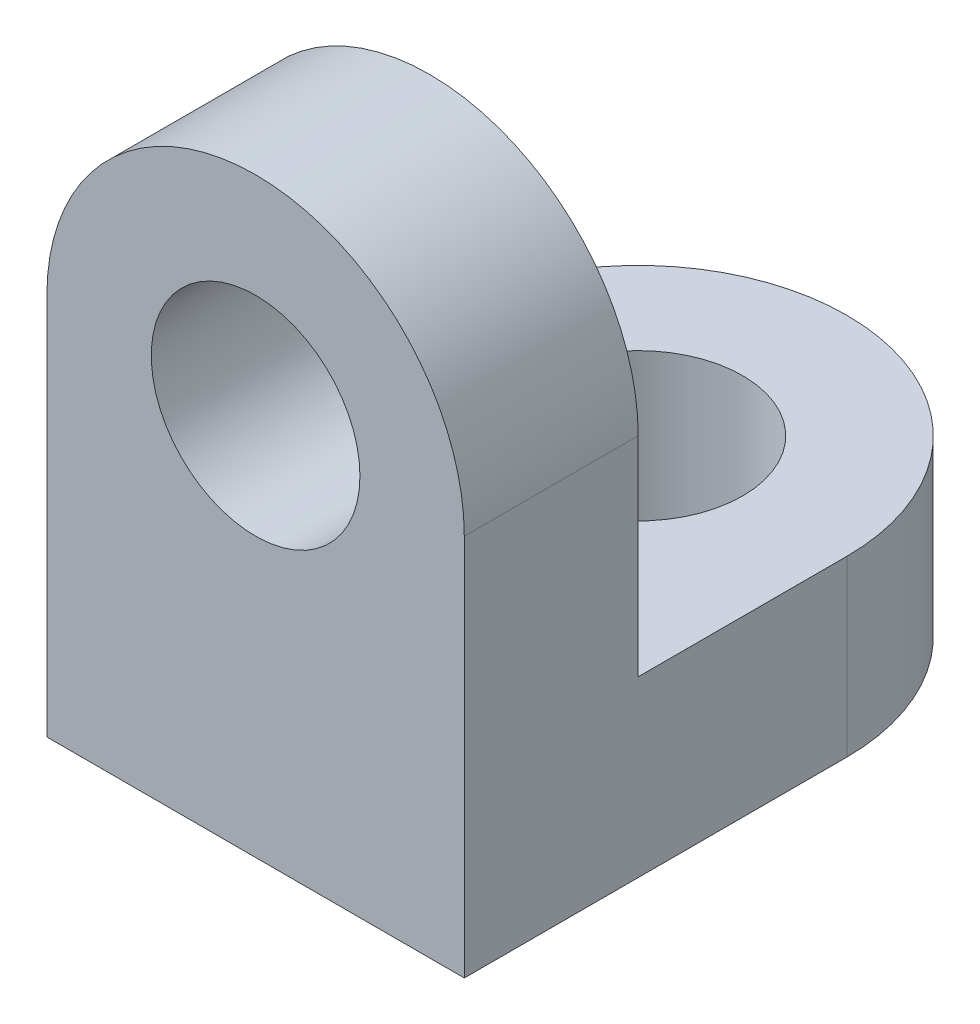
ISO-10303-21;
HEADER;
FILE_DESCRIPTION(('STEP AP214'),'2;1');
FILE_NAME('part.step','',(''),(''),'','','');
FILE_SCHEMA(('AUTOMOTIVE_DESIGN { 1 0 10303 214 1 1 1 1 }'));
ENDSEC;
DATA;
#1=APPLICATION_CONTEXT('core data for automotive mechanical design processes');
#2=APPLICATION_PROTOCOL_DEFINITION('international standard','automotive_design',2000,#1);
#3=PRODUCT_CONTEXT('',#1,'mechanical');
#4=PRODUCT('Part','Part','',(#3));
#5=PRODUCT_RELATED_PRODUCT_CATEGORY('part','',(#4));
#6=PRODUCT_DEFINITION_FORMATION('','',#4);
#7=PRODUCT_DEFINITION_CONTEXT('part definition',#1,'design');
#8=PRODUCT_DEFINITION('design','',#6,#7);
#9=PRODUCT_DEFINITION_SHAPE('','',#8);
#10=(LENGTH_UNIT() NAMED_UNIT(*) SI_UNIT(.MILLI.,.METRE.));
#11=(NAMED_UNIT(*) PLANE_ANGLE_UNIT() SI_UNIT($,.RADIAN.));
#12=(NAMED_UNIT(*) SI_UNIT($,.STERADIAN.) SOLID_ANGLE_UNIT());
#13=UNCERTAINTY_MEASURE_WITH_UNIT(LENGTH_MEASURE(1.E-05),#10,'distance_accuracy_value','');
#14=(GEOMETRIC_REPRESENTATION_CONTEXT(3) GLOBAL_UNCERTAINTY_ASSIGNED_CONTEXT((#13)) GLOBAL_UNIT_ASSIGNED_CONTEXT((#10,
#11,#12)) REPRESENTATION_CONTEXT('',''));
#15=CARTESIAN_POINT('',(0.,0.,0.));
#16=DIRECTION('',(0.,0.,1.));
#17=DIRECTION('',(1.,0.,0.));
#18=AXIS2_PLACEMENT_3D('',#15,#16,#17);
#19=CARTESIAN_POINT('',(0.,0.,10.));
#20=DIRECTION('',(0.,0.,1.));
#21=DIRECTION('',(1.,0.,0.));
#22=AXIS2_PLACEMENT_3D('',#19,#20,#21);
#23=PLANE('',#22);
#24=CARTESIAN_POINT('',(0.,0.,10.));
#25=DIRECTION('',(0.,0.,1.));
#26=DIRECTION('',(1.,0.,0.));
#27=AXIS2_PLACEMENT_3D('',#24,#25,#26);
#28=CIRCLE('',#27,12.);
#29=CARTESIAN_POINT('',(12.,0.,10.));
#30=VERTEX_POINT('',#29);
#31=CARTESIAN_POINT('',(-12.,0.,10.));
#32=VERTEX_POINT('',#31);
#33=EDGE_CURVE('E154',#30,#32,#28,.T.);
#34=ORIENTED_EDGE('',*,*,#33,.T.);
#35=DIRECTION('',(0.,-1.,0.));
#36=VECTOR('',#35,1.);
#37=CARTESIAN_POINT('',(-12.,-12.,10.));
#38=LINE('',#37,#36);
#39=CARTESIAN_POINT('',(-12.,-21.9999999999999,10.));
#40=VERTEX_POINT('',#39);
#41=EDGE_CURVE('E157',#32,#40,#38,.T.);
#42=ORIENTED_EDGE('',*,*,#41,.T.);
#43=DIRECTION('',(-1.,0.,0.));
#44=VECTOR('',#43,1.);
#45=CARTESIAN_POINT('',(26.1421356237309,-21.9999999999999,10.));
#46=LINE('',#45,#44);
#47=CARTESIAN_POINT('',(12.,-21.9999999999999,10.));
#48=VERTEX_POINT('',#47);
#49=EDGE_CURVE('E117',#48,#40,#46,.T.);
#50=ORIENTED_EDGE('',*,*,#49,.F.);
#51=DIRECTION('',(0.,1.,0.));
#52=VECTOR('',#51,1.);
#53=CARTESIAN_POINT('',(12.,0.,10.));
#54=LINE('',#53,#52);
#55=EDGE_CURVE('E57',#48,#30,#54,.T.);
#56=ORIENTED_EDGE('',*,*,#55,.T.);
#57=EDGE_LOOP('',(#34,#42,#50,#56));
#58=FACE_BOUND('',#57,.T.);
#59=CARTESIAN_POINT('',(0.,0.,10.));
#60=DIRECTION('',(0.,0.,1.));
#61=DIRECTION('',(1.,0.,0.));
#62=AXIS2_PLACEMENT_3D('',#59,#60,#61);
#63=CIRCLE('',#62,6.);
#64=CARTESIAN_POINT('',(6.,0.,10.));
#65=VERTEX_POINT('',#64);
#66=EDGE_CURVE('E146',#65,#65,#63,.T.);
#67=ORIENTED_EDGE('',*,*,#66,.F.);
#68=EDGE_LOOP('',(#67));
#69=FACE_BOUND('',#68,.T.);
#70=ADVANCED_FACE('F39',(#58,#69),#23,.T.);
#71=CARTESIAN_POINT('',(0.,0.,0.));
#72=DIRECTION('',(0.,0.,1.));
#73=DIRECTION('',(1.,0.,0.));
#74=AXIS2_PLACEMENT_3D('',#71,#72,#73);
#75=PLANE('',#74);
#76=CARTESIAN_POINT('',(0.,0.,0.));
#77=DIRECTION('',(0.,0.,1.));
#78=DIRECTION('',(1.,0.,0.));
#79=AXIS2_PLACEMENT_3D('',#76,#77,#78);
#80=CIRCLE('',#79,12.);
#81=CARTESIAN_POINT('',(12.,0.,0.));
#82=VERTEX_POINT('',#81);
#83=CARTESIAN_POINT('',(-12.,0.,0.));
#84=VERTEX_POINT('',#83);
#85=EDGE_CURVE('E150',#82,#84,#80,.T.);
#86=ORIENTED_EDGE('',*,*,#85,.F.);
#87=DIRECTION('',(0.,1.,0.));
#88=VECTOR('',#87,1.);
#89=CARTESIAN_POINT('',(12.,0.,0.));
#90=LINE('',#89,#88);
#91=CARTESIAN_POINT('',(12.,-12.,0.));
#92=VERTEX_POINT('',#91);
#93=EDGE_CURVE('E158',#92,#82,#90,.T.);
#94=ORIENTED_EDGE('',*,*,#93,.F.);
#95=DIRECTION('',(1.,0.,0.));
#96=VECTOR('',#95,1.);
#97=CARTESIAN_POINT('',(12.,-12.,0.));
#98=LINE('',#97,#96);
#99=CARTESIAN_POINT('',(-12.,-12.,0.));
#100=VERTEX_POINT('',#99);
#101=EDGE_CURVE('E127',#100,#92,#98,.T.);
#102=ORIENTED_EDGE('',*,*,#101,.F.);
#103=DIRECTION('',(0.,-1.,0.));
#104=VECTOR('',#103,1.);
#105=CARTESIAN_POINT('',(-12.,-12.,0.));
#106=LINE('',#105,#104);
#107=EDGE_CURVE('E69',#84,#100,#106,.T.);
#108=ORIENTED_EDGE('',*,*,#107,.F.);
#109=EDGE_LOOP('',(#86,#94,#102,#108));
#110=FACE_BOUND('',#109,.T.);
#111=CARTESIAN_POINT('',(0.,0.,0.));
#112=DIRECTION('',(0.,0.,1.));
#113=DIRECTION('',(1.,0.,0.));
#114=AXIS2_PLACEMENT_3D('',#111,#112,#113);
#115=CIRCLE('',#114,6.);
#116=CARTESIAN_POINT('',(6.,0.,0.));
#117=VERTEX_POINT('',#116);
#118=EDGE_CURVE('E108',#117,#117,#115,.T.);
#119=ORIENTED_EDGE('',*,*,#118,.T.);
#120=EDGE_LOOP('',(#119));
#121=FACE_BOUND('',#120,.T.);
#122=ADVANCED_FACE('F174',(#110,#121),#75,.F.);
#123=CARTESIAN_POINT('',(0.,0.,10.));
#124=DIRECTION('',(0.,0.,-1.));
#125=DIRECTION('',(-1.,0.,0.));
#126=AXIS2_PLACEMENT_3D('',#123,#124,#125);
#127=CYLINDRICAL_SURFACE('',#126,12.);
#128=ORIENTED_EDGE('',*,*,#85,.T.);
#129=DIRECTION('',(0.,0.,-1.));
#130=VECTOR('',#129,1.);
#131=CARTESIAN_POINT('',(-12.,0.,10.));
#132=LINE('',#131,#130);
#133=EDGE_CURVE('E11',#32,#84,#132,.T.);
#134=ORIENTED_EDGE('',*,*,#133,.F.);
#135=ORIENTED_EDGE('',*,*,#33,.F.);
#136=DIRECTION('',(0.,0.,-1.));
#137=VECTOR('',#136,1.);
#138=CARTESIAN_POINT('',(12.,0.,10.));
#139=LINE('',#138,#137);
#140=EDGE_CURVE('E49',#30,#82,#139,.T.);
#141=ORIENTED_EDGE('',*,*,#140,.T.);
#142=EDGE_LOOP('',(#128,#134,#135,#141));
#143=FACE_BOUND('',#142,.T.);
#144=ADVANCED_FACE('F41',(#143),#127,.T.);
#145=CARTESIAN_POINT('',(-12.,-12.,10.));
#146=DIRECTION('',(1.,0.,0.));
#147=DIRECTION('',(0.,0.,-1.));
#148=AXIS2_PLACEMENT_3D('',#145,#146,#147);
#149=PLANE('',#148);
#150=ORIENTED_EDGE('',*,*,#107,.T.);
#151=DIRECTION('',(0.,0.,1.));
#152=VECTOR('',#151,1.);
#153=CARTESIAN_POINT('',(-12.,-12.,0.));
#154=LINE('',#153,#152);
#155=CARTESIAN_POINT('',(-12.,-12.0000000000001,-12.));
#156=VERTEX_POINT('',#155);
#157=EDGE_CURVE('E102',#156,#100,#154,.T.);
#158=ORIENTED_EDGE('',*,*,#157,.F.);
#159=DIRECTION('',(0.,1.,0.));
#160=VECTOR('',#159,1.);
#161=CARTESIAN_POINT('',(-12.,-22.0000000000001,-11.9999999999999));
#162=LINE('',#161,#160);
#163=CARTESIAN_POINT('',(-12.,-22.0000000000001,-11.9999999999999));
#164=VERTEX_POINT('',#163);
#165=EDGE_CURVE('E96',#164,#156,#162,.T.);
#166=ORIENTED_EDGE('',*,*,#165,.F.);
#167=DIRECTION('',(0.,0.,1.));
#168=VECTOR('',#167,1.);
#169=CARTESIAN_POINT('',(-12.,-22.,1.04083408558608E-13));
#170=LINE('',#169,#168);
#171=EDGE_CURVE('E99',#164,#40,#170,.T.);
#172=ORIENTED_EDGE('',*,*,#171,.T.);
#173=ORIENTED_EDGE('',*,*,#41,.F.);
#174=ORIENTED_EDGE('',*,*,#133,.T.);
#175=EDGE_LOOP('',(#150,#158,#166,#172,#173,#174));
#176=FACE_BOUND('',#175,.T.);
#177=ADVANCED_FACE('F98',(#176),#149,.F.);
#178=CARTESIAN_POINT('',(12.,0.,10.));
#179=DIRECTION('',(-1.,0.,0.));
#180=DIRECTION('',(0.,-1.,0.));
#181=AXIS2_PLACEMENT_3D('',#178,#179,#180);
#182=PLANE('',#181);
#183=ORIENTED_EDGE('',*,*,#93,.T.);
#184=ORIENTED_EDGE('',*,*,#140,.F.);
#185=ORIENTED_EDGE('',*,*,#55,.F.);
#186=DIRECTION('',(0.,0.,-1.));
#187=VECTOR('',#186,1.);
#188=CARTESIAN_POINT('',(12.,-22.0000000000001,-11.9999999999999));
#189=LINE('',#188,#187);
#190=CARTESIAN_POINT('',(12.,-22.0000000000001,-11.9999999999999));
#191=VERTEX_POINT('',#190);
#192=EDGE_CURVE('E119',#48,#191,#189,.T.);
#193=ORIENTED_EDGE('',*,*,#192,.T.);
#194=DIRECTION('',(0.,1.,0.));
#195=VECTOR('',#194,1.);
#196=CARTESIAN_POINT('',(12.,-22.0000000000001,-11.9999999999999));
#197=LINE('',#196,#195);
#198=CARTESIAN_POINT('',(12.,-12.0000000000001,-12.));
#199=VERTEX_POINT('',#198);
#200=EDGE_CURVE('E109',#191,#199,#197,.T.);
#201=ORIENTED_EDGE('',*,*,#200,.T.);
#202=DIRECTION('',(0.,0.,-1.));
#203=VECTOR('',#202,1.);
#204=CARTESIAN_POINT('',(12.,-12.0000000000001,-12.));
#205=LINE('',#204,#203);
#206=EDGE_CURVE('E123',#92,#199,#205,.T.);
#207=ORIENTED_EDGE('',*,*,#206,.F.);
#208=EDGE_LOOP('',(#183,#184,#185,#193,#201,#207));
#209=FACE_BOUND('',#208,.T.);
#210=ADVANCED_FACE('F177',(#209),#182,.F.);
#211=CARTESIAN_POINT('',(0.,0.,10.));
#212=DIRECTION('',(0.,0.,-1.));
#213=DIRECTION('',(-1.,0.,0.));
#214=AXIS2_PLACEMENT_3D('',#211,#212,#213);
#215=CYLINDRICAL_SURFACE('',#214,6.);
#216=ORIENTED_EDGE('',*,*,#66,.T.);
#217=EDGE_LOOP('',(#216));
#218=FACE_BOUND('',#217,.T.);
#219=ORIENTED_EDGE('',*,*,#118,.F.);
#220=EDGE_LOOP('',(#219));
#221=FACE_BOUND('',#220,.T.);
#222=ADVANCED_FACE('F209',(#218,#221),#215,.F.);
#223=CARTESIAN_POINT('',(0.,-22.0000000000001,-11.9999999999999));
#224=DIRECTION('',(0.,-1.,0.));
#225=DIRECTION('',(1.,0.,0.));
#226=AXIS2_PLACEMENT_3D('',#223,#224,#225);
#227=PLANE('',#226);
#228=CARTESIAN_POINT('',(0.,-22.0000000000001,-11.9999999999999));
#229=DIRECTION('',(0.,1.,0.));
#230=DIRECTION('',(1.,0.,0.));
#231=AXIS2_PLACEMENT_3D('',#228,#229,#230);
#232=CIRCLE('',#231,12.);
#233=EDGE_CURVE('E116',#191,#164,#232,.T.);
#234=ORIENTED_EDGE('',*,*,#233,.F.);
#235=ORIENTED_EDGE('',*,*,#192,.F.);
#236=ORIENTED_EDGE('',*,*,#49,.T.);
#237=ORIENTED_EDGE('',*,*,#171,.F.);
#238=EDGE_LOOP('',(#234,#235,#236,#237));
#239=FACE_BOUND('',#238,.T.);
#240=CARTESIAN_POINT('',(0.,-22.0000000000001,-11.9999999999999));
#241=DIRECTION('',(0.,1.,0.));
#242=DIRECTION('',(1.,0.,0.));
#243=AXIS2_PLACEMENT_3D('',#240,#241,#242);
#244=CIRCLE('',#243,6.);
#245=CARTESIAN_POINT('',(6.,-22.0000000000001,-11.9999999999999));
#246=VERTEX_POINT('',#245);
#247=EDGE_CURVE('E138',#246,#246,#244,.T.);
#248=ORIENTED_EDGE('',*,*,#247,.T.);
#249=EDGE_LOOP('',(#248));
#250=FACE_BOUND('',#249,.T.);
#251=ADVANCED_FACE('F113',(#239,#250),#227,.T.);
#252=CARTESIAN_POINT('',(0.,-12.0000000000001,-12.));
#253=DIRECTION('',(0.,-1.,0.));
#254=DIRECTION('',(1.,0.,0.));
#255=AXIS2_PLACEMENT_3D('',#252,#253,#254);
#256=PLANE('',#255);
#257=CARTESIAN_POINT('',(0.,-12.0000000000001,-12.));
#258=DIRECTION('',(0.,1.,0.));
#259=DIRECTION('',(1.,0.,0.));
#260=AXIS2_PLACEMENT_3D('',#257,#258,#259);
#261=CIRCLE('',#260,12.);
#262=EDGE_CURVE('E135',#199,#156,#261,.T.);
#263=ORIENTED_EDGE('',*,*,#262,.T.);
#264=ORIENTED_EDGE('',*,*,#157,.T.);
#265=ORIENTED_EDGE('',*,*,#101,.T.);
#266=ORIENTED_EDGE('',*,*,#206,.T.);
#267=EDGE_LOOP('',(#263,#264,#265,#266));
#268=FACE_BOUND('',#267,.T.);
#269=CARTESIAN_POINT('',(0.,-12.0000000000001,-12.));
#270=DIRECTION('',(0.,1.,0.));
#271=DIRECTION('',(1.,0.,0.));
#272=AXIS2_PLACEMENT_3D('',#269,#270,#271);
#273=CIRCLE('',#272,6.);
#274=CARTESIAN_POINT('',(6.,-12.0000000000001,-12.));
#275=VERTEX_POINT('',#274);
#276=EDGE_CURVE('E130',#275,#275,#273,.T.);
#277=ORIENTED_EDGE('',*,*,#276,.F.);
#278=EDGE_LOOP('',(#277));
#279=FACE_BOUND('',#278,.T.);
#280=ADVANCED_FACE('F179',(#268,#279),#256,.F.);
#281=CARTESIAN_POINT('',(0.,-22.0000000000001,-11.9999999999999));
#282=DIRECTION('',(0.,1.,0.));
#283=DIRECTION('',(-1.,0.,0.));
#284=AXIS2_PLACEMENT_3D('',#281,#282,#283);
#285=CYLINDRICAL_SURFACE('',#284,12.);
#286=ORIENTED_EDGE('',*,*,#262,.F.);
#287=ORIENTED_EDGE('',*,*,#200,.F.);
#288=ORIENTED_EDGE('',*,*,#233,.T.);
#289=ORIENTED_EDGE('',*,*,#165,.T.);
#290=EDGE_LOOP('',(#286,#287,#288,#289));
#291=FACE_BOUND('',#290,.T.);
#292=ADVANCED_FACE('F121',(#291),#285,.T.);
#293=CARTESIAN_POINT('',(0.,-22.0000000000001,-11.9999999999999));
#294=DIRECTION('',(0.,1.,0.));
#295=DIRECTION('',(-1.,0.,0.));
#296=AXIS2_PLACEMENT_3D('',#293,#294,#295);
#297=CYLINDRICAL_SURFACE('',#296,6.);
#298=ORIENTED_EDGE('',*,*,#247,.F.);
#299=EDGE_LOOP('',(#298));
#300=FACE_BOUND('',#299,.T.);
#301=ORIENTED_EDGE('',*,*,#276,.T.);
#302=EDGE_LOOP('',(#301));
#303=FACE_BOUND('',#302,.T.);
#304=ADVANCED_FACE('F193',(#300,#303),#297,.F.);
#305=CLOSED_SHELL('',(#70,#122,#144,#177,#210,#222,#251,#280,#292,#304));
#306=MANIFOLD_SOLID_BREP('B2',#305);
#307=ADVANCED_BREP_SHAPE_REPRESENTATION('',(#18,#306),#14);
#308=SHAPE_DEFINITION_REPRESENTATION(#9,#307);
ENDSEC;
END-ISO-10303-21;
